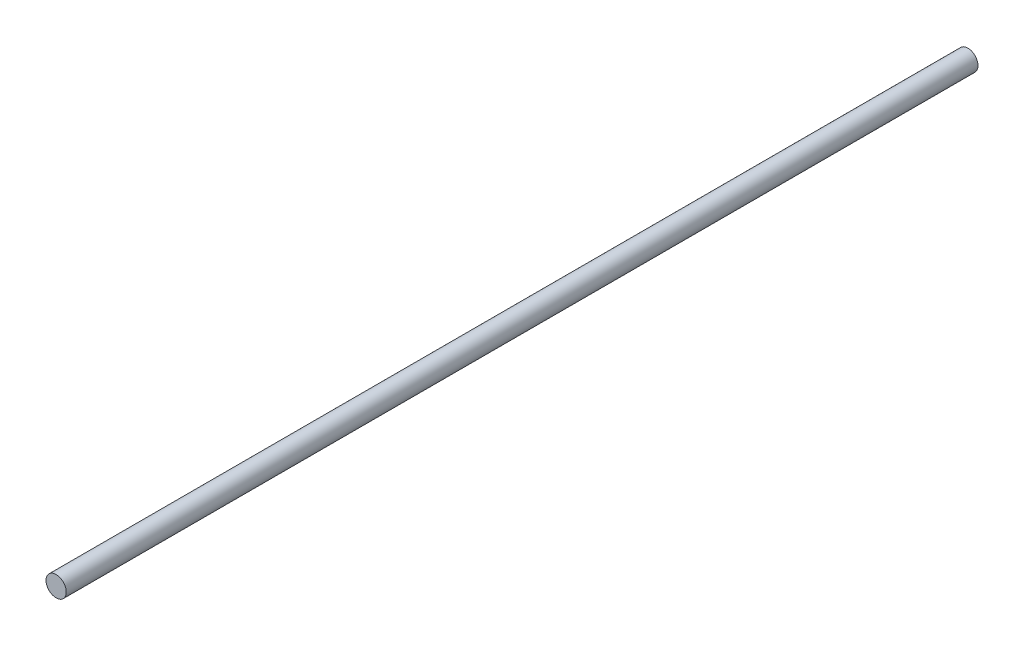
ISO-10303-21;
HEADER;
FILE_DESCRIPTION(('STEP AP214'),'2;1');
FILE_NAME('part.step','',(''),(''),'','','');
FILE_SCHEMA(('AUTOMOTIVE_DESIGN { 1 0 10303 214 1 1 1 1 }'));
ENDSEC;
DATA;
#1=APPLICATION_CONTEXT('core data for automotive mechanical design processes');
#2=APPLICATION_PROTOCOL_DEFINITION('international standard','automotive_design',2000,#1);
#3=PRODUCT_CONTEXT('',#1,'mechanical');
#4=PRODUCT('Part','Part','',(#3));
#5=PRODUCT_RELATED_PRODUCT_CATEGORY('part','',(#4));
#6=PRODUCT_DEFINITION_FORMATION('','',#4);
#7=PRODUCT_DEFINITION_CONTEXT('part definition',#1,'design');
#8=PRODUCT_DEFINITION('design','',#6,#7);
#9=PRODUCT_DEFINITION_SHAPE('','',#8);
#10=(LENGTH_UNIT() NAMED_UNIT(*) SI_UNIT(.MILLI.,.METRE.));
#11=(NAMED_UNIT(*) PLANE_ANGLE_UNIT() SI_UNIT($,.RADIAN.));
#12=(NAMED_UNIT(*) SI_UNIT($,.STERADIAN.) SOLID_ANGLE_UNIT());
#13=UNCERTAINTY_MEASURE_WITH_UNIT(LENGTH_MEASURE(1.E-05),#10,'distance_accuracy_value','');
#14=(GEOMETRIC_REPRESENTATION_CONTEXT(3) GLOBAL_UNCERTAINTY_ASSIGNED_CONTEXT((#13)) GLOBAL_UNIT_ASSIGNED_CONTEXT((#10,
#11,#12)) REPRESENTATION_CONTEXT('',''));
#15=CARTESIAN_POINT('',(0.,0.,0.));
#16=DIRECTION('',(0.,0.,1.));
#17=DIRECTION('',(1.,0.,0.));
#18=AXIS2_PLACEMENT_3D('',#15,#16,#17);
#19=CARTESIAN_POINT('',(0.,0.,90.));
#20=DIRECTION('',(0.,0.,-1.));
#21=DIRECTION('',(-1.,0.,0.));
#22=AXIS2_PLACEMENT_3D('',#19,#20,#21);
#23=CYLINDRICAL_SURFACE('',#22,1.);
#24=CARTESIAN_POINT('',(0.,0.,90.));
#25=DIRECTION('',(0.,0.,1.));
#26=DIRECTION('',(1.,0.,0.));
#27=AXIS2_PLACEMENT_3D('',#24,#25,#26);
#28=CIRCLE('',#27,1.);
#29=CARTESIAN_POINT('',(-1.,0.,90.));
#30=VERTEX_POINT('',#29);
#31=EDGE_CURVE('E10',#30,#30,#28,.T.);
#32=CARTESIAN_POINT('',(0.,0.,0.));
#33=DIRECTION('',(0.,0.,1.));
#34=DIRECTION('',(1.,0.,0.));
#35=AXIS2_PLACEMENT_3D('',#32,#33,#34);
#36=CIRCLE('',#35,1.);
#37=CARTESIAN_POINT('',(-1.,0.,0.));
#38=VERTEX_POINT('',#37);
#39=EDGE_CURVE('E44',#38,#38,#36,.T.);
#40=CARTESIAN_POINT('',(-1.,0.,90.));
#41=CARTESIAN_POINT('',(-1.,0.,89.0625));
#42=CARTESIAN_POINT('',(-1.,0.,88.125));
#43=CARTESIAN_POINT('',(-1.,0.,86.25));
#44=CARTESIAN_POINT('',(-1.,0.,85.3125));
#45=CARTESIAN_POINT('',(-1.,0.,83.4375));
#46=CARTESIAN_POINT('',(-1.,0.,82.5));
#47=CARTESIAN_POINT('',(-1.,0.,80.625));
#48=CARTESIAN_POINT('',(-1.,0.,79.6875));
#49=CARTESIAN_POINT('',(-1.,0.,77.8125));
#50=CARTESIAN_POINT('',(-1.,0.,76.875));
#51=CARTESIAN_POINT('',(-1.,0.,75.));
#52=CARTESIAN_POINT('',(-1.,0.,74.0625));
#53=CARTESIAN_POINT('',(-1.,0.,72.1875));
#54=CARTESIAN_POINT('',(-1.,0.,71.25));
#55=CARTESIAN_POINT('',(-1.,0.,69.375));
#56=CARTESIAN_POINT('',(-1.,0.,68.4375));
#57=CARTESIAN_POINT('',(-1.,0.,66.5625));
#58=CARTESIAN_POINT('',(-1.,0.,65.625));
#59=CARTESIAN_POINT('',(-1.,0.,63.75));
#60=CARTESIAN_POINT('',(-1.,0.,62.8125));
#61=CARTESIAN_POINT('',(-1.,0.,60.9375));
#62=CARTESIAN_POINT('',(-1.,0.,60.));
#63=CARTESIAN_POINT('',(-1.,0.,58.125));
#64=CARTESIAN_POINT('',(-1.,0.,57.1875));
#65=CARTESIAN_POINT('',(-1.,0.,55.3125));
#66=CARTESIAN_POINT('',(-1.,0.,54.375));
#67=CARTESIAN_POINT('',(-1.,0.,52.5));
#68=CARTESIAN_POINT('',(-1.,0.,51.5625));
#69=CARTESIAN_POINT('',(-1.,0.,49.6875));
#70=CARTESIAN_POINT('',(-1.,0.,48.75));
#71=CARTESIAN_POINT('',(-1.,0.,46.875));
#72=CARTESIAN_POINT('',(-1.,0.,45.9375));
#73=CARTESIAN_POINT('',(-1.,0.,44.0625));
#74=CARTESIAN_POINT('',(-1.,0.,43.125));
#75=CARTESIAN_POINT('',(-1.,0.,41.25));
#76=CARTESIAN_POINT('',(-1.,0.,40.3125));
#77=CARTESIAN_POINT('',(-1.,0.,38.4375));
#78=CARTESIAN_POINT('',(-1.,0.,37.5));
#79=CARTESIAN_POINT('',(-1.,0.,35.625));
#80=CARTESIAN_POINT('',(-1.,0.,34.6875));
#81=CARTESIAN_POINT('',(-1.,0.,32.8125));
#82=CARTESIAN_POINT('',(-1.,0.,31.875));
#83=CARTESIAN_POINT('',(-1.,0.,30.));
#84=CARTESIAN_POINT('',(-1.,0.,29.0625));
#85=CARTESIAN_POINT('',(-1.,0.,27.1875));
#86=CARTESIAN_POINT('',(-1.,0.,26.25));
#87=CARTESIAN_POINT('',(-1.,0.,24.375));
#88=CARTESIAN_POINT('',(-1.,0.,23.4375));
#89=CARTESIAN_POINT('',(-1.,0.,21.5625));
#90=CARTESIAN_POINT('',(-1.,0.,20.625));
#91=CARTESIAN_POINT('',(-1.,0.,18.75));
#92=CARTESIAN_POINT('',(-1.,0.,17.8125));
#93=CARTESIAN_POINT('',(-1.,0.,15.9375));
#94=CARTESIAN_POINT('',(-1.,0.,15.));
#95=CARTESIAN_POINT('',(-1.,0.,13.125));
#96=CARTESIAN_POINT('',(-1.,0.,12.1875));
#97=CARTESIAN_POINT('',(-1.,0.,10.3125));
#98=CARTESIAN_POINT('',(-1.,0.,9.37499999999999));
#99=CARTESIAN_POINT('',(-1.,0.,7.49999999999999));
#100=CARTESIAN_POINT('',(-1.,0.,6.56249999999999));
#101=CARTESIAN_POINT('',(-1.,0.,4.68749999999999));
#102=CARTESIAN_POINT('',(-1.,0.,3.74999999999998));
#103=CARTESIAN_POINT('',(-1.,0.,1.87499999999998));
#104=CARTESIAN_POINT('',(-1.,0.,0.937499999999986));
#105=CARTESIAN_POINT('',(-1.,0.,0.));
#106=B_SPLINE_CURVE_WITH_KNOTS('',3,(#40,#41,#42,#43,#44,#45,#46,#47,#48,#49,#50,#51,#52,#53,
#54,#55,#56,#57,#58,#59,#60,#61,#62,#63,#64,#65,#66,#67,#68,#69,#70,#71,#72,#73,#74,#75,#76,#77,
#78,#79,#80,#81,#82,#83,#84,#85,#86,#87,#88,#89,#90,#91,#92,#93,#94,#95,#96,#97,#98,#99,#100,
#101,#102,#103,#104,#105),.UNSPECIFIED.,.F.,.F.,(4,2,2,2,2,2,2,2,2,2,2,2,2,2,2,2,2,2,2,2,2,2,2,
2,2,2,2,2,2,2,2,2,4),(0.,2.81250000000001,5.62500000000001,8.43750000000001,11.25,14.0625,
16.875,19.6875,22.5,25.3125,28.125,30.9375,33.75,36.5625,39.375,42.1875,45.,47.8125,50.625,
53.4375,56.25,59.0625,61.875,64.6875,67.5,70.3125,73.125,75.9375,78.75,81.5625,84.375,87.1875,
90.),.UNSPECIFIED.);
#107=EDGE_CURVE('BSEAM41',#30,#38,#106,.T.);
#108=ORIENTED_EDGE('',*,*,#31,.F.);
#109=ORIENTED_EDGE('',*,*,#39,.T.);
#110=ORIENTED_EDGE('',*,*,#107,.T.);
#111=ORIENTED_EDGE('',*,*,#107,.F.);
#112=EDGE_LOOP('',(#108,#110,#109,#111));
#113=FACE_BOUND('',#112,.T.);
#114=ADVANCED_FACE('F41',(#113),#23,.T.);
#115=CARTESIAN_POINT('',(0.,0.,90.));
#116=DIRECTION('',(0.,0.,1.));
#117=DIRECTION('',(1.,0.,0.));
#118=AXIS2_PLACEMENT_3D('',#115,#116,#117);
#119=PLANE('',#118);
#120=ORIENTED_EDGE('',*,*,#31,.T.);
#121=EDGE_LOOP('',(#120));
#122=FACE_BOUND('',#121,.T.);
#123=ADVANCED_FACE('F58',(#122),#119,.T.);
#124=CARTESIAN_POINT('',(0.,0.,0.));
#125=DIRECTION('',(0.,0.,1.));
#126=DIRECTION('',(1.,0.,0.));
#127=AXIS2_PLACEMENT_3D('',#124,#125,#126);
#128=PLANE('',#127);
#129=ORIENTED_EDGE('',*,*,#39,.F.);
#130=EDGE_LOOP('',(#129));
#131=FACE_BOUND('',#130,.T.);
#132=ADVANCED_FACE('F56',(#131),#128,.F.);
#133=CLOSED_SHELL('',(#114,#123,#132));
#134=MANIFOLD_SOLID_BREP('B2',#133);
#135=ADVANCED_BREP_SHAPE_REPRESENTATION('',(#18,#134),#14);
#136=SHAPE_DEFINITION_REPRESENTATION(#9,#135);
ENDSEC;
END-ISO-10303-21;
